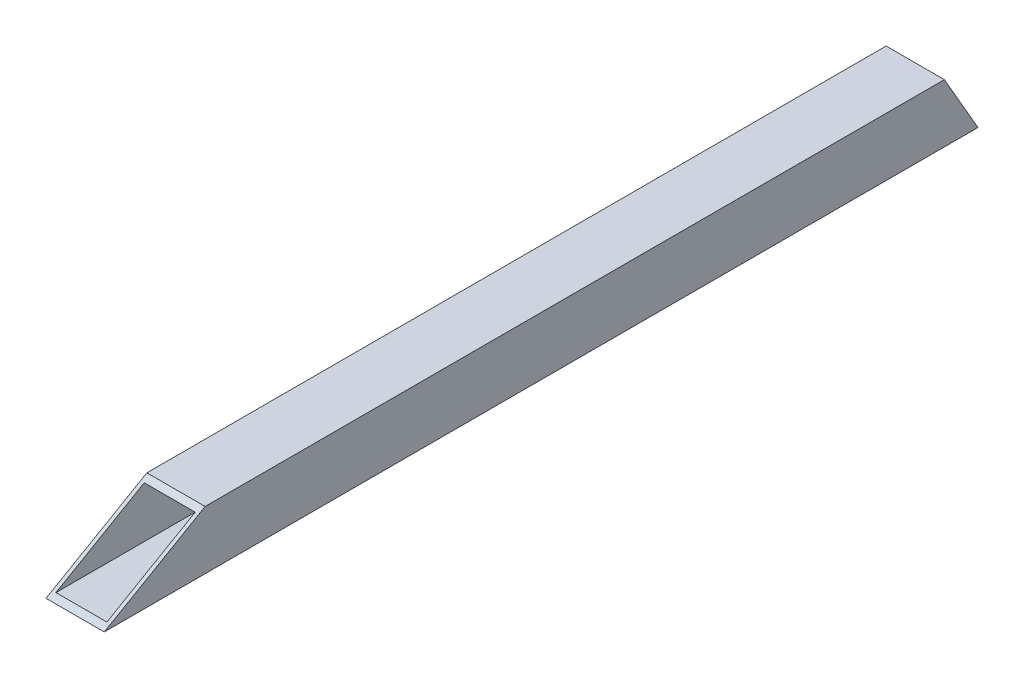
ISO-10303-21;
HEADER;
FILE_DESCRIPTION(('STEP AP214'),'2;1');
FILE_NAME('part.step','',(''),(''),'','','');
FILE_SCHEMA(('AUTOMOTIVE_DESIGN { 1 0 10303 214 1 1 1 1 }'));
ENDSEC;
DATA;
#1=APPLICATION_CONTEXT('core data for automotive mechanical design processes');
#2=APPLICATION_PROTOCOL_DEFINITION('international standard','automotive_design',2000,#1);
#3=PRODUCT_CONTEXT('',#1,'mechanical');
#4=PRODUCT('Part','Part','',(#3));
#5=PRODUCT_RELATED_PRODUCT_CATEGORY('part','',(#4));
#6=PRODUCT_DEFINITION_FORMATION('','',#4);
#7=PRODUCT_DEFINITION_CONTEXT('part definition',#1,'design');
#8=PRODUCT_DEFINITION('design','',#6,#7);
#9=PRODUCT_DEFINITION_SHAPE('','',#8);
#10=(LENGTH_UNIT() NAMED_UNIT(*) SI_UNIT(.MILLI.,.METRE.));
#11=(NAMED_UNIT(*) PLANE_ANGLE_UNIT() SI_UNIT($,.RADIAN.));
#12=(NAMED_UNIT(*) SI_UNIT($,.STERADIAN.) SOLID_ANGLE_UNIT());
#13=UNCERTAINTY_MEASURE_WITH_UNIT(LENGTH_MEASURE(1.E-05),#10,'distance_accuracy_value','');
#14=(GEOMETRIC_REPRESENTATION_CONTEXT(3) GLOBAL_UNCERTAINTY_ASSIGNED_CONTEXT((#13)) GLOBAL_UNIT_ASSIGNED_CONTEXT((#10,
#11,#12)) REPRESENTATION_CONTEXT('',''));
#15=CARTESIAN_POINT('',(0.,0.,0.));
#16=DIRECTION('',(0.,0.,1.));
#17=DIRECTION('',(1.,0.,0.));
#18=AXIS2_PLACEMENT_3D('',#15,#16,#17);
#19=CARTESIAN_POINT('',(25.4,-25.4,762.));
#20=DIRECTION('',(-1.,0.,0.));
#21=DIRECTION('',(0.,0.,1.));
#22=AXIS2_PLACEMENT_3D('',#19,#20,#21);
#23=PLANE('',#22);
#24=DIRECTION('',(0.,0.,-1.));
#25=VECTOR('',#24,1.);
#26=CARTESIAN_POINT('',(25.4,25.4,762.));
#27=LINE('',#26,#25);
#28=CARTESIAN_POINT('',(25.4,25.4,674.0118189755));
#29=VERTEX_POINT('',#28);
#30=CARTESIAN_POINT('',(25.4,25.4,29.3293936748331));
#31=VERTEX_POINT('',#30);
#32=EDGE_CURVE('E114',#29,#31,#27,.T.);
#33=ORIENTED_EDGE('',*,*,#32,.F.);
#34=DIRECTION('',(0.,-0.499999999999995,0.866025403784442));
#35=VECTOR('',#34,1.);
#36=CARTESIAN_POINT('',(25.4,-25.4,762.));
#37=LINE('',#36,#35);
#38=CARTESIAN_POINT('',(25.4,-25.4,762.));
#39=VERTEX_POINT('',#38);
#40=EDGE_CURVE('E97',#29,#39,#37,.T.);
#41=ORIENTED_EDGE('',*,*,#40,.T.);
#42=DIRECTION('',(0.,0.,-1.));
#43=VECTOR('',#42,1.);
#44=CARTESIAN_POINT('',(25.4,-25.4,762.));
#45=LINE('',#44,#43);
#46=CARTESIAN_POINT('',(25.4,-25.4,0.));
#47=VERTEX_POINT('',#46);
#48=EDGE_CURVE('E128',#39,#47,#45,.T.);
#49=ORIENTED_EDGE('',*,*,#48,.T.);
#50=DIRECTION('',(0.,0.866025403784438,0.500000000000002));
#51=VECTOR('',#50,1.);
#52=CARTESIAN_POINT('',(25.4,-25.4,0.));
#53=LINE('',#52,#51);
#54=EDGE_CURVE('E120',#47,#31,#53,.T.);
#55=ORIENTED_EDGE('',*,*,#54,.T.);
#56=EDGE_LOOP('',(#33,#41,#49,#55));
#57=FACE_BOUND('',#56,.T.);
#58=ADVANCED_FACE('F33',(#57),#23,.F.);
#59=CARTESIAN_POINT('',(-25.4,25.4,762.));
#60=DIRECTION('',(0.,-1.,0.));
#61=DIRECTION('',(0.,0.,-1.));
#62=AXIS2_PLACEMENT_3D('',#59,#60,#61);
#63=PLANE('',#62);
#64=DIRECTION('',(0.,0.,-1.));
#65=VECTOR('',#64,1.);
#66=CARTESIAN_POINT('',(-25.4,25.4,762.));
#67=LINE('',#66,#65);
#68=CARTESIAN_POINT('',(-25.4,25.4,674.0118189755));
#69=VERTEX_POINT('',#68);
#70=CARTESIAN_POINT('',(-25.4,25.4,29.3293936748331));
#71=VERTEX_POINT('',#70);
#72=EDGE_CURVE('E116',#69,#71,#67,.T.);
#73=ORIENTED_EDGE('',*,*,#72,.F.);
#74=DIRECTION('',(-1.,0.,0.));
#75=VECTOR('',#74,1.);
#76=CARTESIAN_POINT('',(25.4,25.4,674.0118189755));
#77=LINE('',#76,#75);
#78=EDGE_CURVE('E100',#29,#69,#77,.T.);
#79=ORIENTED_EDGE('',*,*,#78,.F.);
#80=ORIENTED_EDGE('',*,*,#32,.T.);
#81=DIRECTION('',(-1.,0.,0.));
#82=VECTOR('',#81,1.);
#83=CARTESIAN_POINT('',(25.4,25.4,29.3293936748331));
#84=LINE('',#83,#82);
#85=EDGE_CURVE('E149',#31,#71,#84,.T.);
#86=ORIENTED_EDGE('',*,*,#85,.T.);
#87=EDGE_LOOP('',(#73,#79,#80,#86));
#88=FACE_BOUND('',#87,.T.);
#89=ADVANCED_FACE('F112',(#88),#63,.F.);
#90=CARTESIAN_POINT('',(-25.4,-25.4,762.));
#91=DIRECTION('',(1.,0.,0.));
#92=DIRECTION('',(0.,0.,-1.));
#93=AXIS2_PLACEMENT_3D('',#90,#91,#92);
#94=PLANE('',#93);
#95=DIRECTION('',(0.,0.,-1.));
#96=VECTOR('',#95,1.);
#97=CARTESIAN_POINT('',(-25.4,-25.4,762.));
#98=LINE('',#97,#96);
#99=CARTESIAN_POINT('',(-25.4,-25.4,762.));
#100=VERTEX_POINT('',#99);
#101=CARTESIAN_POINT('',(-25.4,-25.4,0.));
#102=VERTEX_POINT('',#101);
#103=EDGE_CURVE('E123',#100,#102,#98,.T.);
#104=ORIENTED_EDGE('',*,*,#103,.F.);
#105=DIRECTION('',(0.,-0.499999999999995,0.866025403784442));
#106=VECTOR('',#105,1.);
#107=CARTESIAN_POINT('',(-25.4,-25.4,762.));
#108=LINE('',#107,#106);
#109=EDGE_CURVE('E108',#69,#100,#108,.T.);
#110=ORIENTED_EDGE('',*,*,#109,.F.);
#111=ORIENTED_EDGE('',*,*,#72,.T.);
#112=DIRECTION('',(0.,0.866025403784438,0.500000000000002));
#113=VECTOR('',#112,1.);
#114=CARTESIAN_POINT('',(-25.4,-25.4,0.));
#115=LINE('',#114,#113);
#116=EDGE_CURVE('E151',#102,#71,#115,.T.);
#117=ORIENTED_EDGE('',*,*,#116,.F.);
#118=EDGE_LOOP('',(#104,#110,#111,#117));
#119=FACE_BOUND('',#118,.T.);
#120=ADVANCED_FACE('F162',(#119),#94,.F.);
#121=CARTESIAN_POINT('',(-25.4,-25.4,762.));
#122=DIRECTION('',(0.,1.,0.));
#123=DIRECTION('',(0.,0.,1.));
#124=AXIS2_PLACEMENT_3D('',#121,#122,#123);
#125=PLANE('',#124);
#126=DIRECTION('',(1.,0.,0.));
#127=VECTOR('',#126,1.);
#128=CARTESIAN_POINT('',(-25.4,-25.4,0.));
#129=LINE('',#128,#127);
#130=EDGE_CURVE('E130',#102,#47,#129,.T.);
#131=ORIENTED_EDGE('',*,*,#130,.T.);
#132=ORIENTED_EDGE('',*,*,#48,.F.);
#133=DIRECTION('',(1.,0.,0.));
#134=VECTOR('',#133,1.);
#135=CARTESIAN_POINT('',(-25.4,-25.4,762.));
#136=LINE('',#135,#134);
#137=EDGE_CURVE('E103',#100,#39,#136,.T.);
#138=ORIENTED_EDGE('',*,*,#137,.F.);
#139=ORIENTED_EDGE('',*,*,#103,.T.);
#140=EDGE_LOOP('',(#131,#132,#138,#139));
#141=FACE_BOUND('',#140,.T.);
#142=ADVANCED_FACE('F164',(#141),#125,.F.);
#143=CARTESIAN_POINT('',(22.225,-22.225,762.));
#144=DIRECTION('',(-1.,0.,0.));
#145=DIRECTION('',(0.,0.,1.));
#146=AXIS2_PLACEMENT_3D('',#143,#144,#145);
#147=PLANE('',#146);
#148=DIRECTION('',(0.,-0.499999999999995,0.866025403784442));
#149=VECTOR('',#148,1.);
#150=CARTESIAN_POINT('',(22.225,-24.60625,760.625184671492));
#151=LINE('',#150,#149);
#152=CARTESIAN_POINT('',(22.225,22.225,679.511080289531));
#153=VERTEX_POINT('',#152);
#154=CARTESIAN_POINT('',(22.225,-22.225,756.500738685969));
#155=VERTEX_POINT('',#154);
#156=EDGE_CURVE('E46',#153,#155,#151,.T.);
#157=ORIENTED_EDGE('',*,*,#156,.F.);
#158=DIRECTION('',(0.,0.,-1.));
#159=VECTOR('',#158,1.);
#160=CARTESIAN_POINT('',(22.225,22.225,762.));
#161=LINE('',#160,#159);
#162=CARTESIAN_POINT('',(22.225,22.225,27.4963065701561));
#163=VERTEX_POINT('',#162);
#164=EDGE_CURVE('E133',#153,#163,#161,.T.);
#165=ORIENTED_EDGE('',*,*,#164,.T.);
#166=DIRECTION('',(0.,0.866025403784438,0.500000000000002));
#167=VECTOR('',#166,1.);
#168=CARTESIAN_POINT('',(22.225,306.936928841872,191.874815328509));
#169=LINE('',#168,#167);
#170=CARTESIAN_POINT('',(22.225,-22.225,1.83308710467711));
#171=VERTEX_POINT('',#170);
#172=EDGE_CURVE('E141',#171,#163,#169,.T.);
#173=ORIENTED_EDGE('',*,*,#172,.F.);
#174=DIRECTION('',(0.,0.,-1.));
#175=VECTOR('',#174,1.);
#176=CARTESIAN_POINT('',(22.225,-22.225,762.));
#177=LINE('',#176,#175);
#178=EDGE_CURVE('E139',#155,#171,#177,.T.);
#179=ORIENTED_EDGE('',*,*,#178,.F.);
#180=EDGE_LOOP('',(#157,#165,#173,#179));
#181=FACE_BOUND('',#180,.T.);
#182=ADVANCED_FACE('F190',(#181),#147,.T.);
#183=CARTESIAN_POINT('',(-22.225,22.225,762.));
#184=DIRECTION('',(0.,-1.,0.));
#185=DIRECTION('',(0.,0.,-1.));
#186=AXIS2_PLACEMENT_3D('',#183,#184,#185);
#187=PLANE('',#186);
#188=DIRECTION('',(1.,0.,0.));
#189=VECTOR('',#188,1.);
#190=CARTESIAN_POINT('',(-22.225,22.225,679.511080289531));
#191=LINE('',#190,#189);
#192=CARTESIAN_POINT('',(-22.225,22.225,679.511080289531));
#193=VERTEX_POINT('',#192);
#194=EDGE_CURVE('E156',#193,#153,#191,.T.);
#195=ORIENTED_EDGE('',*,*,#194,.F.);
#196=DIRECTION('',(0.,0.,-1.));
#197=VECTOR('',#196,1.);
#198=CARTESIAN_POINT('',(-22.225,22.225,762.));
#199=LINE('',#198,#197);
#200=CARTESIAN_POINT('',(-22.225,22.225,27.496306570156));
#201=VERTEX_POINT('',#200);
#202=EDGE_CURVE('E136',#193,#201,#199,.T.);
#203=ORIENTED_EDGE('',*,*,#202,.T.);
#204=DIRECTION('',(-1.,0.,0.));
#205=VECTOR('',#204,1.);
#206=CARTESIAN_POINT('',(-22.225,22.225,27.4963065701561));
#207=LINE('',#206,#205);
#208=EDGE_CURVE('E144',#163,#201,#207,.T.);
#209=ORIENTED_EDGE('',*,*,#208,.F.);
#210=ORIENTED_EDGE('',*,*,#164,.F.);
#211=EDGE_LOOP('',(#195,#203,#209,#210));
#212=FACE_BOUND('',#211,.T.);
#213=ADVANCED_FACE('F193',(#212),#187,.T.);
#214=CARTESIAN_POINT('',(-22.225,-22.225,762.));
#215=DIRECTION('',(1.,0.,0.));
#216=DIRECTION('',(0.,0.,-1.));
#217=AXIS2_PLACEMENT_3D('',#214,#215,#216);
#218=PLANE('',#217);
#219=DIRECTION('',(0.,0.499999999999995,-0.866025403784442));
#220=VECTOR('',#219,1.);
#221=CARTESIAN_POINT('',(-22.225,-24.60625,760.625184671492));
#222=LINE('',#221,#220);
#223=CARTESIAN_POINT('',(-22.225,-22.225,756.500738685969));
#224=VERTEX_POINT('',#223);
#225=EDGE_CURVE('E117',#224,#193,#222,.T.);
#226=ORIENTED_EDGE('',*,*,#225,.F.);
#227=DIRECTION('',(0.,0.,-1.));
#228=VECTOR('',#227,1.);
#229=CARTESIAN_POINT('',(-22.225,-22.225,762.));
#230=LINE('',#229,#228);
#231=CARTESIAN_POINT('',(-22.225,-22.225,1.83308710467711));
#232=VERTEX_POINT('',#231);
#233=EDGE_CURVE('E54',#224,#232,#230,.T.);
#234=ORIENTED_EDGE('',*,*,#233,.T.);
#235=DIRECTION('',(0.,-0.866025403784438,-0.500000000000002));
#236=VECTOR('',#235,1.);
#237=CARTESIAN_POINT('',(-22.225,306.936928841872,191.874815328509));
#238=LINE('',#237,#236);
#239=EDGE_CURVE('E147',#201,#232,#238,.T.);
#240=ORIENTED_EDGE('',*,*,#239,.F.);
#241=ORIENTED_EDGE('',*,*,#202,.F.);
#242=EDGE_LOOP('',(#226,#234,#240,#241));
#243=FACE_BOUND('',#242,.T.);
#244=ADVANCED_FACE('F176',(#243),#218,.T.);
#245=CARTESIAN_POINT('',(-22.225,-22.225,762.));
#246=DIRECTION('',(0.,1.,0.));
#247=DIRECTION('',(0.,0.,1.));
#248=AXIS2_PLACEMENT_3D('',#245,#246,#247);
#249=PLANE('',#248);
#250=DIRECTION('',(-1.,0.,0.));
#251=VECTOR('',#250,1.);
#252=CARTESIAN_POINT('',(-22.225,-22.225,756.500738685969));
#253=LINE('',#252,#251);
#254=EDGE_CURVE('E11',#155,#224,#253,.T.);
#255=ORIENTED_EDGE('',*,*,#254,.F.);
#256=ORIENTED_EDGE('',*,*,#178,.T.);
#257=DIRECTION('',(1.,0.,0.));
#258=VECTOR('',#257,1.);
#259=CARTESIAN_POINT('',(-22.225,-22.225,1.83308710467711));
#260=LINE('',#259,#258);
#261=EDGE_CURVE('E40',#232,#171,#260,.T.);
#262=ORIENTED_EDGE('',*,*,#261,.F.);
#263=ORIENTED_EDGE('',*,*,#233,.F.);
#264=EDGE_LOOP('',(#255,#256,#262,#263));
#265=FACE_BOUND('',#264,.T.);
#266=ADVANCED_FACE('F168',(#265),#249,.T.);
#267=CARTESIAN_POINT('',(25.4,-25.4,0.));
#268=DIRECTION('',(0.,-0.500000000000002,0.866025403784438));
#269=DIRECTION('',(0.,-0.866025403784438,-0.500000000000002));
#270=AXIS2_PLACEMENT_3D('',#267,#268,#269);
#271=PLANE('',#270);
#272=ORIENTED_EDGE('',*,*,#172,.T.);
#273=ORIENTED_EDGE('',*,*,#208,.T.);
#274=ORIENTED_EDGE('',*,*,#239,.T.);
#275=ORIENTED_EDGE('',*,*,#261,.T.);
#276=EDGE_LOOP('',(#272,#273,#274,#275));
#277=FACE_BOUND('',#276,.T.);
#278=ORIENTED_EDGE('',*,*,#116,.T.);
#279=ORIENTED_EDGE('',*,*,#85,.F.);
#280=ORIENTED_EDGE('',*,*,#54,.F.);
#281=ORIENTED_EDGE('',*,*,#130,.F.);
#282=EDGE_LOOP('',(#278,#279,#280,#281));
#283=FACE_BOUND('',#282,.T.);
#284=ADVANCED_FACE('F166',(#277,#283),#271,.F.);
#285=CARTESIAN_POINT('',(25.4,-25.4,762.));
#286=DIRECTION('',(0.,-0.866025403784442,-0.499999999999995));
#287=DIRECTION('',(0.,0.499999999999995,-0.866025403784442));
#288=AXIS2_PLACEMENT_3D('',#285,#286,#287);
#289=PLANE('',#288);
#290=ORIENTED_EDGE('',*,*,#156,.T.);
#291=ORIENTED_EDGE('',*,*,#254,.T.);
#292=ORIENTED_EDGE('',*,*,#225,.T.);
#293=ORIENTED_EDGE('',*,*,#194,.T.);
#294=EDGE_LOOP('',(#290,#291,#292,#293));
#295=FACE_BOUND('',#294,.T.);
#296=ORIENTED_EDGE('',*,*,#109,.T.);
#297=ORIENTED_EDGE('',*,*,#137,.T.);
#298=ORIENTED_EDGE('',*,*,#40,.F.);
#299=ORIENTED_EDGE('',*,*,#78,.T.);
#300=EDGE_LOOP('',(#296,#297,#298,#299));
#301=FACE_BOUND('',#300,.T.);
#302=ADVANCED_FACE('F99',(#295,#301),#289,.F.);
#303=CLOSED_SHELL('',(#58,#89,#120,#142,#182,#213,#244,#266,#284,#302));
#304=MANIFOLD_SOLID_BREP('B2',#303);
#305=ADVANCED_BREP_SHAPE_REPRESENTATION('',(#18,#304),#14);
#306=SHAPE_DEFINITION_REPRESENTATION(#9,#305);
ENDSEC;
END-ISO-10303-21;
